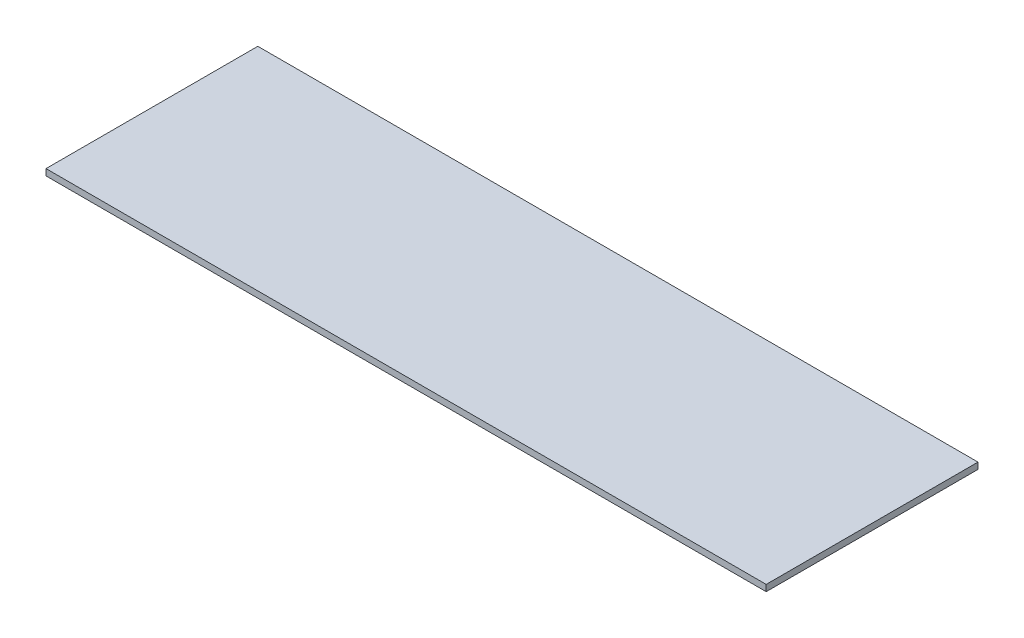
ISO-10303-21;
HEADER;
FILE_DESCRIPTION(('STEP AP214'),'2;1');
FILE_NAME('part.step','',(''),(''),'','','');
FILE_SCHEMA(('AUTOMOTIVE_DESIGN { 1 0 10303 214 1 1 1 1 }'));
ENDSEC;
DATA;
#1=APPLICATION_CONTEXT('core data for automotive mechanical design processes');
#2=APPLICATION_PROTOCOL_DEFINITION('international standard','automotive_design',2000,#1);
#3=PRODUCT_CONTEXT('',#1,'mechanical');
#4=PRODUCT('Part','Part','',(#3));
#5=PRODUCT_RELATED_PRODUCT_CATEGORY('part','',(#4));
#6=PRODUCT_DEFINITION_FORMATION('','',#4);
#7=PRODUCT_DEFINITION_CONTEXT('part definition',#1,'design');
#8=PRODUCT_DEFINITION('design','',#6,#7);
#9=PRODUCT_DEFINITION_SHAPE('','',#8);
#10=(LENGTH_UNIT() NAMED_UNIT(*) SI_UNIT(.MILLI.,.METRE.));
#11=(NAMED_UNIT(*) PLANE_ANGLE_UNIT() SI_UNIT($,.RADIAN.));
#12=(NAMED_UNIT(*) SI_UNIT($,.STERADIAN.) SOLID_ANGLE_UNIT());
#13=UNCERTAINTY_MEASURE_WITH_UNIT(LENGTH_MEASURE(1.E-05),#10,'distance_accuracy_value','');
#14=(GEOMETRIC_REPRESENTATION_CONTEXT(3) GLOBAL_UNCERTAINTY_ASSIGNED_CONTEXT((#13)) GLOBAL_UNIT_ASSIGNED_CONTEXT((#10,
#11,#12)) REPRESENTATION_CONTEXT('',''));
#15=CARTESIAN_POINT('',(0.,0.,0.));
#16=DIRECTION('',(0.,0.,1.));
#17=DIRECTION('',(1.,0.,0.));
#18=AXIS2_PLACEMENT_3D('',#15,#16,#17);
#19=CARTESIAN_POINT('',(0.,18.,0.));
#20=DIRECTION('',(1.,0.,0.));
#21=DIRECTION('',(0.,0.,-1.));
#22=AXIS2_PLACEMENT_3D('',#19,#20,#21);
#23=PLANE('',#22);
#24=DIRECTION('',(0.,0.,1.));
#25=VECTOR('',#24,1.);
#26=CARTESIAN_POINT('',(0.,0.,0.));
#27=LINE('',#26,#25);
#28=CARTESIAN_POINT('',(0.,0.,-600.));
#29=VERTEX_POINT('',#28);
#30=CARTESIAN_POINT('',(0.,0.,0.));
#31=VERTEX_POINT('',#30);
#32=EDGE_CURVE('E96',#29,#31,#27,.T.);
#33=ORIENTED_EDGE('',*,*,#32,.T.);
#34=DIRECTION('',(0.,-1.,0.));
#35=VECTOR('',#34,1.);
#36=CARTESIAN_POINT('',(0.,18.,0.));
#37=LINE('',#36,#35);
#38=CARTESIAN_POINT('',(0.,18.,0.));
#39=VERTEX_POINT('',#38);
#40=EDGE_CURVE('E11',#39,#31,#37,.T.);
#41=ORIENTED_EDGE('',*,*,#40,.F.);
#42=DIRECTION('',(0.,0.,1.));
#43=VECTOR('',#42,1.);
#44=CARTESIAN_POINT('',(0.,18.,0.));
#45=LINE('',#44,#43);
#46=CARTESIAN_POINT('',(0.,18.,-600.));
#47=VERTEX_POINT('',#46);
#48=EDGE_CURVE('E84',#47,#39,#45,.T.);
#49=ORIENTED_EDGE('',*,*,#48,.F.);
#50=DIRECTION('',(0.,-1.,0.));
#51=VECTOR('',#50,1.);
#52=CARTESIAN_POINT('',(0.,18.,-600.));
#53=LINE('',#52,#51);
#54=EDGE_CURVE('E92',#47,#29,#53,.T.);
#55=ORIENTED_EDGE('',*,*,#54,.T.);
#56=EDGE_LOOP('',(#33,#41,#49,#55));
#57=FACE_BOUND('',#56,.T.);
#58=ADVANCED_FACE('F33',(#57),#23,.F.);
#59=CARTESIAN_POINT('',(0.,18.,0.));
#60=DIRECTION('',(0.,0.,-1.));
#61=DIRECTION('',(-1.,0.,0.));
#62=AXIS2_PLACEMENT_3D('',#59,#60,#61);
#63=PLANE('',#62);
#64=DIRECTION('',(1.,0.,0.));
#65=VECTOR('',#64,1.);
#66=CARTESIAN_POINT('',(0.,0.,0.));
#67=LINE('',#66,#65);
#68=CARTESIAN_POINT('',(2040.,0.,0.));
#69=VERTEX_POINT('',#68);
#70=EDGE_CURVE('E88',#31,#69,#67,.T.);
#71=ORIENTED_EDGE('',*,*,#70,.T.);
#72=DIRECTION('',(0.,-1.,0.));
#73=VECTOR('',#72,1.);
#74=CARTESIAN_POINT('',(2040.,18.,0.));
#75=LINE('',#74,#73);
#76=CARTESIAN_POINT('',(2040.,18.,0.));
#77=VERTEX_POINT('',#76);
#78=EDGE_CURVE('E41',#77,#69,#75,.T.);
#79=ORIENTED_EDGE('',*,*,#78,.F.);
#80=DIRECTION('',(1.,0.,0.));
#81=VECTOR('',#80,1.);
#82=CARTESIAN_POINT('',(0.,18.,0.));
#83=LINE('',#82,#81);
#84=EDGE_CURVE('E79',#39,#77,#83,.T.);
#85=ORIENTED_EDGE('',*,*,#84,.F.);
#86=ORIENTED_EDGE('',*,*,#40,.T.);
#87=EDGE_LOOP('',(#71,#79,#85,#86));
#88=FACE_BOUND('',#87,.T.);
#89=ADVANCED_FACE('F87',(#88),#63,.F.);
#90=CARTESIAN_POINT('',(2040.,18.,0.));
#91=DIRECTION('',(-1.,0.,0.));
#92=DIRECTION('',(0.,0.,1.));
#93=AXIS2_PLACEMENT_3D('',#90,#91,#92);
#94=PLANE('',#93);
#95=DIRECTION('',(0.,0.,-1.));
#96=VECTOR('',#95,1.);
#97=CARTESIAN_POINT('',(2040.,0.,0.));
#98=LINE('',#97,#96);
#99=CARTESIAN_POINT('',(2040.,0.,-600.));
#100=VERTEX_POINT('',#99);
#101=EDGE_CURVE('E66',#69,#100,#98,.T.);
#102=ORIENTED_EDGE('',*,*,#101,.T.);
#103=DIRECTION('',(0.,-1.,0.));
#104=VECTOR('',#103,1.);
#105=CARTESIAN_POINT('',(2040.,18.,-600.));
#106=LINE('',#105,#104);
#107=CARTESIAN_POINT('',(2040.,18.,-600.));
#108=VERTEX_POINT('',#107);
#109=EDGE_CURVE('E89',#108,#100,#106,.T.);
#110=ORIENTED_EDGE('',*,*,#109,.F.);
#111=DIRECTION('',(0.,0.,-1.));
#112=VECTOR('',#111,1.);
#113=CARTESIAN_POINT('',(2040.,18.,0.));
#114=LINE('',#113,#112);
#115=EDGE_CURVE('E82',#77,#108,#114,.T.);
#116=ORIENTED_EDGE('',*,*,#115,.F.);
#117=ORIENTED_EDGE('',*,*,#78,.T.);
#118=EDGE_LOOP('',(#102,#110,#116,#117));
#119=FACE_BOUND('',#118,.T.);
#120=ADVANCED_FACE('F90',(#119),#94,.F.);
#121=CARTESIAN_POINT('',(0.,18.,-600.));
#122=DIRECTION('',(0.,0.,1.));
#123=DIRECTION('',(1.,0.,0.));
#124=AXIS2_PLACEMENT_3D('',#121,#122,#123);
#125=PLANE('',#124);
#126=DIRECTION('',(-1.,0.,0.));
#127=VECTOR('',#126,1.);
#128=CARTESIAN_POINT('',(0.,0.,-600.));
#129=LINE('',#128,#127);
#130=EDGE_CURVE('E72',#100,#29,#129,.T.);
#131=ORIENTED_EDGE('',*,*,#130,.T.);
#132=ORIENTED_EDGE('',*,*,#54,.F.);
#133=DIRECTION('',(-1.,0.,0.));
#134=VECTOR('',#133,1.);
#135=CARTESIAN_POINT('',(0.,18.,-600.));
#136=LINE('',#135,#134);
#137=EDGE_CURVE('E49',#108,#47,#136,.T.);
#138=ORIENTED_EDGE('',*,*,#137,.F.);
#139=ORIENTED_EDGE('',*,*,#109,.T.);
#140=EDGE_LOOP('',(#131,#132,#138,#139));
#141=FACE_BOUND('',#140,.T.);
#142=ADVANCED_FACE('F103',(#141),#125,.F.);
#143=CARTESIAN_POINT('',(0.,18.,0.));
#144=DIRECTION('',(0.,-1.,0.));
#145=DIRECTION('',(0.,0.,-1.));
#146=AXIS2_PLACEMENT_3D('',#143,#144,#145);
#147=PLANE('',#146);
#148=ORIENTED_EDGE('',*,*,#48,.T.);
#149=ORIENTED_EDGE('',*,*,#84,.T.);
#150=ORIENTED_EDGE('',*,*,#115,.T.);
#151=ORIENTED_EDGE('',*,*,#137,.T.);
#152=EDGE_LOOP('',(#148,#149,#150,#151));
#153=FACE_BOUND('',#152,.T.);
#154=ADVANCED_FACE('F80',(#153),#147,.F.);
#155=CARTESIAN_POINT('',(0.,0.,0.));
#156=DIRECTION('',(0.,-1.,0.));
#157=DIRECTION('',(0.,0.,-1.));
#158=AXIS2_PLACEMENT_3D('',#155,#156,#157);
#159=PLANE('',#158);
#160=ORIENTED_EDGE('',*,*,#32,.F.);
#161=ORIENTED_EDGE('',*,*,#130,.F.);
#162=ORIENTED_EDGE('',*,*,#101,.F.);
#163=ORIENTED_EDGE('',*,*,#70,.F.);
#164=EDGE_LOOP('',(#160,#161,#162,#163));
#165=FACE_BOUND('',#164,.T.);
#166=ADVANCED_FACE('F106',(#165),#159,.T.);
#167=CLOSED_SHELL('',(#58,#89,#120,#142,#154,#166));
#168=MANIFOLD_SOLID_BREP('B2',#167);
#169=ADVANCED_BREP_SHAPE_REPRESENTATION('',(#18,#168),#14);
#170=SHAPE_DEFINITION_REPRESENTATION(#9,#169);
ENDSEC;
END-ISO-10303-21;
